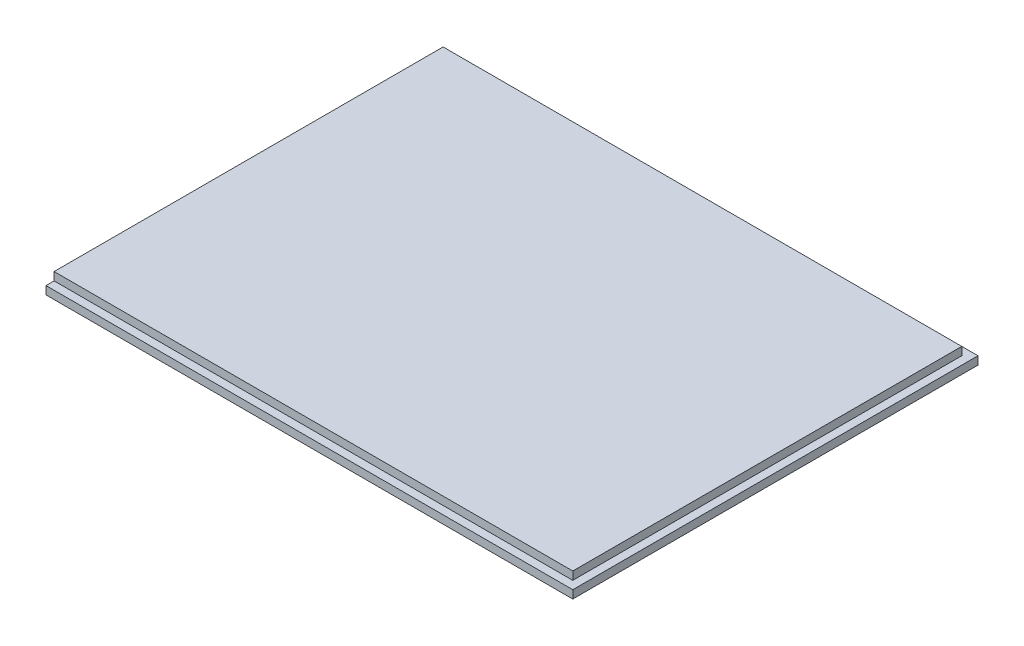
ISO-10303-21;
HEADER;
FILE_DESCRIPTION(('STEP AP214'),'2;1');
FILE_NAME('part.step','',(''),(''),'','','');
FILE_SCHEMA(('AUTOMOTIVE_DESIGN { 1 0 10303 214 1 1 1 1 }'));
ENDSEC;
DATA;
#1=APPLICATION_CONTEXT('core data for automotive mechanical design processes');
#2=APPLICATION_PROTOCOL_DEFINITION('international standard','automotive_design',2000,#1);
#3=PRODUCT_CONTEXT('',#1,'mechanical');
#4=PRODUCT('Part','Part','',(#3));
#5=PRODUCT_RELATED_PRODUCT_CATEGORY('part','',(#4));
#6=PRODUCT_DEFINITION_FORMATION('','',#4);
#7=PRODUCT_DEFINITION_CONTEXT('part definition',#1,'design');
#8=PRODUCT_DEFINITION('design','',#6,#7);
#9=PRODUCT_DEFINITION_SHAPE('','',#8);
#10=(LENGTH_UNIT() NAMED_UNIT(*) SI_UNIT(.MILLI.,.METRE.));
#11=(NAMED_UNIT(*) PLANE_ANGLE_UNIT() SI_UNIT($,.RADIAN.));
#12=(NAMED_UNIT(*) SI_UNIT($,.STERADIAN.) SOLID_ANGLE_UNIT());
#13=UNCERTAINTY_MEASURE_WITH_UNIT(LENGTH_MEASURE(1.E-05),#10,'distance_accuracy_value','');
#14=(GEOMETRIC_REPRESENTATION_CONTEXT(3) GLOBAL_UNCERTAINTY_ASSIGNED_CONTEXT((#13)) GLOBAL_UNIT_ASSIGNED_CONTEXT((#10,
#11,#12)) REPRESENTATION_CONTEXT('',''));
#15=CARTESIAN_POINT('',(0.,0.,0.));
#16=DIRECTION('',(0.,0.,1.));
#17=DIRECTION('',(1.,0.,0.));
#18=AXIS2_PLACEMENT_3D('',#15,#16,#17);
#19=CARTESIAN_POINT('',(0.,0.,0.));
#20=DIRECTION('',(1.,0.,0.));
#21=DIRECTION('',(0.,1.,0.));
#22=AXIS2_PLACEMENT_3D('',#19,#20,#21);
#23=PLANE('',#22);
#24=DIRECTION('',(0.,0.,1.));
#25=VECTOR('',#24,1.);
#26=CARTESIAN_POINT('',(0.,0.,0.));
#27=LINE('',#26,#25);
#28=CARTESIAN_POINT('',(0.,0.,-79.375));
#29=VERTEX_POINT('',#28);
#30=CARTESIAN_POINT('',(0.,0.,79.375));
#31=VERTEX_POINT('',#30);
#32=EDGE_CURVE('E11',#29,#31,#27,.T.);
#33=ORIENTED_EDGE('',*,*,#32,.T.);
#34=DIRECTION('',(0.,-1.,0.));
#35=VECTOR('',#34,1.);
#36=CARTESIAN_POINT('',(0.,3.1750000000018,79.375));
#37=LINE('',#36,#35);
#38=CARTESIAN_POINT('',(0.,3.175,79.375));
#39=VERTEX_POINT('',#38);
#40=EDGE_CURVE('E165',#39,#31,#37,.T.);
#41=ORIENTED_EDGE('',*,*,#40,.F.);
#42=DIRECTION('',(0.,0.,1.));
#43=VECTOR('',#42,1.);
#44=CARTESIAN_POINT('',(0.,3.175,0.));
#45=LINE('',#44,#43);
#46=CARTESIAN_POINT('',(0.,3.175,76.2));
#47=VERTEX_POINT('',#46);
#48=EDGE_CURVE('E167',#47,#39,#45,.T.);
#49=ORIENTED_EDGE('',*,*,#48,.F.);
#50=DIRECTION('',(0.,-1.,0.));
#51=VECTOR('',#50,1.);
#52=CARTESIAN_POINT('',(0.,6.35000000000178,76.2));
#53=LINE('',#52,#51);
#54=CARTESIAN_POINT('',(0.,6.35,76.2));
#55=VERTEX_POINT('',#54);
#56=EDGE_CURVE('E162',#55,#47,#53,.T.);
#57=ORIENTED_EDGE('',*,*,#56,.F.);
#58=DIRECTION('',(0.,0.,1.));
#59=VECTOR('',#58,1.);
#60=CARTESIAN_POINT('',(0.,6.35,0.));
#61=LINE('',#60,#59);
#62=CARTESIAN_POINT('',(0.,6.35,-76.2));
#63=VERTEX_POINT('',#62);
#64=EDGE_CURVE('E160',#63,#55,#61,.T.);
#65=ORIENTED_EDGE('',*,*,#64,.F.);
#66=DIRECTION('',(0.,1.,0.));
#67=VECTOR('',#66,1.);
#68=CARTESIAN_POINT('',(0.,6.35000000000178,-76.2));
#69=LINE('',#68,#67);
#70=CARTESIAN_POINT('',(0.,3.175,-76.2));
#71=VERTEX_POINT('',#70);
#72=EDGE_CURVE('E112',#71,#63,#69,.T.);
#73=ORIENTED_EDGE('',*,*,#72,.F.);
#74=CARTESIAN_POINT('',(0.,3.175,-79.375));
#75=VERTEX_POINT('',#74);
#76=EDGE_CURVE('E50',#75,#71,#45,.T.);
#77=ORIENTED_EDGE('',*,*,#76,.F.);
#78=DIRECTION('',(0.,1.,0.));
#79=VECTOR('',#78,1.);
#80=CARTESIAN_POINT('',(0.,3.1750000000018,-79.375));
#81=LINE('',#80,#79);
#82=EDGE_CURVE('E57',#29,#75,#81,.T.);
#83=ORIENTED_EDGE('',*,*,#82,.F.);
#84=EDGE_LOOP('',(#33,#41,#49,#57,#65,#73,#77,#83));
#85=FACE_BOUND('',#84,.T.);
#86=ADVANCED_FACE('F43',(#85),#23,.F.);
#87=CARTESIAN_POINT('',(206.375,3.175,79.375));
#88=DIRECTION('',(-1.,0.,0.));
#89=DIRECTION('',(0.,0.,1.));
#90=AXIS2_PLACEMENT_3D('',#87,#88,#89);
#91=PLANE('',#90);
#92=DIRECTION('',(0.,0.,-1.));
#93=VECTOR('',#92,1.);
#94=CARTESIAN_POINT('',(206.375,0.,79.375));
#95=LINE('',#94,#93);
#96=CARTESIAN_POINT('',(206.375,0.,79.375));
#97=VERTEX_POINT('',#96);
#98=CARTESIAN_POINT('',(206.375,0.,-79.375));
#99=VERTEX_POINT('',#98);
#100=EDGE_CURVE('E139',#97,#99,#95,.T.);
#101=ORIENTED_EDGE('',*,*,#100,.T.);
#102=DIRECTION('',(0.,-1.,0.));
#103=VECTOR('',#102,1.);
#104=CARTESIAN_POINT('',(206.375,3.175,-79.375));
#105=LINE('',#104,#103);
#106=CARTESIAN_POINT('',(206.375,3.175,-79.375));
#107=VERTEX_POINT('',#106);
#108=EDGE_CURVE('E157',#107,#99,#105,.T.);
#109=ORIENTED_EDGE('',*,*,#108,.F.);
#110=DIRECTION('',(0.,0.,-1.));
#111=VECTOR('',#110,1.);
#112=CARTESIAN_POINT('',(206.375,3.175,79.375));
#113=LINE('',#112,#111);
#114=CARTESIAN_POINT('',(206.375,3.175,79.375));
#115=VERTEX_POINT('',#114);
#116=EDGE_CURVE('E140',#115,#107,#113,.T.);
#117=ORIENTED_EDGE('',*,*,#116,.F.);
#118=DIRECTION('',(0.,-1.,0.));
#119=VECTOR('',#118,1.);
#120=CARTESIAN_POINT('',(206.375,3.175,79.375));
#121=LINE('',#120,#119);
#122=EDGE_CURVE('E149',#115,#97,#121,.T.);
#123=ORIENTED_EDGE('',*,*,#122,.T.);
#124=EDGE_LOOP('',(#101,#109,#117,#123));
#125=FACE_BOUND('',#124,.T.);
#126=ADVANCED_FACE('F183',(#125),#91,.F.);
#127=CARTESIAN_POINT('',(0.,0.,0.));
#128=DIRECTION('',(0.,-1.,0.));
#129=DIRECTION('',(0.,0.,-1.));
#130=AXIS2_PLACEMENT_3D('',#127,#128,#129);
#131=PLANE('',#130);
#132=ORIENTED_EDGE('',*,*,#32,.F.);
#133=DIRECTION('',(-1.,0.,0.));
#134=VECTOR('',#133,1.);
#135=CARTESIAN_POINT('',(-206.375,0.,-79.375));
#136=LINE('',#135,#134);
#137=EDGE_CURVE('E152',#99,#29,#136,.T.);
#138=ORIENTED_EDGE('',*,*,#137,.F.);
#139=ORIENTED_EDGE('',*,*,#100,.F.);
#140=DIRECTION('',(1.,0.,0.));
#141=VECTOR('',#140,1.);
#142=CARTESIAN_POINT('',(-206.375,0.,79.375));
#143=LINE('',#142,#141);
#144=EDGE_CURVE('E144',#31,#97,#143,.T.);
#145=ORIENTED_EDGE('',*,*,#144,.F.);
#146=EDGE_LOOP('',(#132,#138,#139,#145));
#147=FACE_BOUND('',#146,.T.);
#148=ADVANCED_FACE('F186',(#147),#131,.T.);
#149=CARTESIAN_POINT('',(0.,3.175,0.));
#150=DIRECTION('',(0.,-1.,0.));
#151=DIRECTION('',(0.,0.,-1.));
#152=AXIS2_PLACEMENT_3D('',#149,#150,#151);
#153=PLANE('',#152);
#154=DIRECTION('',(-1.,0.,0.));
#155=VECTOR('',#154,1.);
#156=CARTESIAN_POINT('',(-206.375,3.175,-79.375));
#157=LINE('',#156,#155);
#158=EDGE_CURVE('E143',#107,#75,#157,.T.);
#159=ORIENTED_EDGE('',*,*,#158,.T.);
#160=ORIENTED_EDGE('',*,*,#76,.T.);
#161=DIRECTION('',(-1.,0.,0.));
#162=VECTOR('',#161,1.);
#163=CARTESIAN_POINT('',(-203.2,3.175,-76.2));
#164=LINE('',#163,#162);
#165=CARTESIAN_POINT('',(203.2,3.175,-76.2));
#166=VERTEX_POINT('',#165);
#167=EDGE_CURVE('E131',#166,#71,#164,.T.);
#168=ORIENTED_EDGE('',*,*,#167,.F.);
#169=DIRECTION('',(0.,0.,-1.));
#170=VECTOR('',#169,1.);
#171=CARTESIAN_POINT('',(203.2,3.175,76.2));
#172=LINE('',#171,#170);
#173=CARTESIAN_POINT('',(203.2,3.175,76.2));
#174=VERTEX_POINT('',#173);
#175=EDGE_CURVE('E128',#174,#166,#172,.T.);
#176=ORIENTED_EDGE('',*,*,#175,.F.);
#177=DIRECTION('',(1.,0.,0.));
#178=VECTOR('',#177,1.);
#179=CARTESIAN_POINT('',(-203.2,3.175,76.2));
#180=LINE('',#179,#178);
#181=EDGE_CURVE('E137',#47,#174,#180,.T.);
#182=ORIENTED_EDGE('',*,*,#181,.F.);
#183=ORIENTED_EDGE('',*,*,#48,.T.);
#184=DIRECTION('',(1.,0.,0.));
#185=VECTOR('',#184,1.);
#186=CARTESIAN_POINT('',(-206.375,3.175,79.375));
#187=LINE('',#186,#185);
#188=EDGE_CURVE('E147',#39,#115,#187,.T.);
#189=ORIENTED_EDGE('',*,*,#188,.T.);
#190=ORIENTED_EDGE('',*,*,#116,.T.);
#191=EDGE_LOOP('',(#159,#160,#168,#176,#182,#183,#189,#190));
#192=FACE_BOUND('',#191,.T.);
#193=ADVANCED_FACE('F172',(#192),#153,.F.);
#194=CARTESIAN_POINT('',(203.2,6.35,76.2));
#195=DIRECTION('',(-1.,0.,0.));
#196=DIRECTION('',(0.,0.,1.));
#197=AXIS2_PLACEMENT_3D('',#194,#195,#196);
#198=PLANE('',#197);
#199=DIRECTION('',(0.,-1.,0.));
#200=VECTOR('',#199,1.);
#201=CARTESIAN_POINT('',(203.2,6.35,76.2));
#202=LINE('',#201,#200);
#203=CARTESIAN_POINT('',(203.2,6.35,76.2));
#204=VERTEX_POINT('',#203);
#205=EDGE_CURVE('E129',#204,#174,#202,.T.);
#206=ORIENTED_EDGE('',*,*,#205,.T.);
#207=ORIENTED_EDGE('',*,*,#175,.T.);
#208=DIRECTION('',(0.,-1.,0.));
#209=VECTOR('',#208,1.);
#210=CARTESIAN_POINT('',(203.2,6.35,-76.2));
#211=LINE('',#210,#209);
#212=CARTESIAN_POINT('',(203.2,6.35,-76.2));
#213=VERTEX_POINT('',#212);
#214=EDGE_CURVE('E110',#213,#166,#211,.T.);
#215=ORIENTED_EDGE('',*,*,#214,.F.);
#216=DIRECTION('',(0.,0.,-1.));
#217=VECTOR('',#216,1.);
#218=CARTESIAN_POINT('',(203.2,6.35,76.2));
#219=LINE('',#218,#217);
#220=EDGE_CURVE('E116',#204,#213,#219,.T.);
#221=ORIENTED_EDGE('',*,*,#220,.F.);
#222=EDGE_LOOP('',(#206,#207,#215,#221));
#223=FACE_BOUND('',#222,.T.);
#224=ADVANCED_FACE('F126',(#223),#198,.F.);
#225=CARTESIAN_POINT('',(-203.2,6.35,76.2));
#226=DIRECTION('',(0.,0.,-1.));
#227=DIRECTION('',(-1.,0.,0.));
#228=AXIS2_PLACEMENT_3D('',#225,#226,#227);
#229=PLANE('',#228);
#230=DIRECTION('',(1.,0.,0.));
#231=VECTOR('',#230,1.);
#232=CARTESIAN_POINT('',(-203.2,6.35,76.2));
#233=LINE('',#232,#231);
#234=EDGE_CURVE('E115',#55,#204,#233,.T.);
#235=ORIENTED_EDGE('',*,*,#234,.F.);
#236=ORIENTED_EDGE('',*,*,#56,.T.);
#237=ORIENTED_EDGE('',*,*,#181,.T.);
#238=ORIENTED_EDGE('',*,*,#205,.F.);
#239=EDGE_LOOP('',(#235,#236,#237,#238));
#240=FACE_BOUND('',#239,.T.);
#241=ADVANCED_FACE('F211',(#240),#229,.F.);
#242=CARTESIAN_POINT('',(-203.2,6.35,-76.2));
#243=DIRECTION('',(0.,0.,1.));
#244=DIRECTION('',(1.,0.,0.));
#245=AXIS2_PLACEMENT_3D('',#242,#243,#244);
#246=PLANE('',#245);
#247=ORIENTED_EDGE('',*,*,#167,.T.);
#248=ORIENTED_EDGE('',*,*,#72,.T.);
#249=DIRECTION('',(-1.,0.,0.));
#250=VECTOR('',#249,1.);
#251=CARTESIAN_POINT('',(-203.2,6.35,-76.2));
#252=LINE('',#251,#250);
#253=EDGE_CURVE('E105',#213,#63,#252,.T.);
#254=ORIENTED_EDGE('',*,*,#253,.F.);
#255=ORIENTED_EDGE('',*,*,#214,.T.);
#256=EDGE_LOOP('',(#247,#248,#254,#255));
#257=FACE_BOUND('',#256,.T.);
#258=ADVANCED_FACE('F108',(#257),#246,.F.);
#259=CARTESIAN_POINT('',(0.,6.35,0.));
#260=DIRECTION('',(0.,-1.,0.));
#261=DIRECTION('',(0.,0.,-1.));
#262=AXIS2_PLACEMENT_3D('',#259,#260,#261);
#263=PLANE('',#262);
#264=ORIENTED_EDGE('',*,*,#253,.T.);
#265=ORIENTED_EDGE('',*,*,#64,.T.);
#266=ORIENTED_EDGE('',*,*,#234,.T.);
#267=ORIENTED_EDGE('',*,*,#220,.T.);
#268=EDGE_LOOP('',(#264,#265,#266,#267));
#269=FACE_BOUND('',#268,.T.);
#270=ADVANCED_FACE('F119',(#269),#263,.F.);
#271=CARTESIAN_POINT('',(-206.375,3.175,79.375));
#272=DIRECTION('',(0.,0.,-1.));
#273=DIRECTION('',(-1.,0.,0.));
#274=AXIS2_PLACEMENT_3D('',#271,#272,#273);
#275=PLANE('',#274);
#276=ORIENTED_EDGE('',*,*,#188,.F.);
#277=ORIENTED_EDGE('',*,*,#40,.T.);
#278=ORIENTED_EDGE('',*,*,#144,.T.);
#279=ORIENTED_EDGE('',*,*,#122,.F.);
#280=EDGE_LOOP('',(#276,#277,#278,#279));
#281=FACE_BOUND('',#280,.T.);
#282=ADVANCED_FACE('F178',(#281),#275,.F.);
#283=CARTESIAN_POINT('',(-206.375,3.175,-79.375));
#284=DIRECTION('',(0.,0.,1.));
#285=DIRECTION('',(1.,0.,0.));
#286=AXIS2_PLACEMENT_3D('',#283,#284,#285);
#287=PLANE('',#286);
#288=ORIENTED_EDGE('',*,*,#137,.T.);
#289=ORIENTED_EDGE('',*,*,#82,.T.);
#290=ORIENTED_EDGE('',*,*,#158,.F.);
#291=ORIENTED_EDGE('',*,*,#108,.T.);
#292=EDGE_LOOP('',(#288,#289,#290,#291));
#293=FACE_BOUND('',#292,.T.);
#294=ADVANCED_FACE('F184',(#293),#287,.F.);
#295=CLOSED_SHELL('',(#86,#126,#148,#193,#224,#241,#258,#270,#282,#294));
#296=MANIFOLD_SOLID_BREP('B2',#295);
#297=ADVANCED_BREP_SHAPE_REPRESENTATION('',(#18,#296),#14);
#298=SHAPE_DEFINITION_REPRESENTATION(#9,#297);
ENDSEC;
END-ISO-10303-21;
